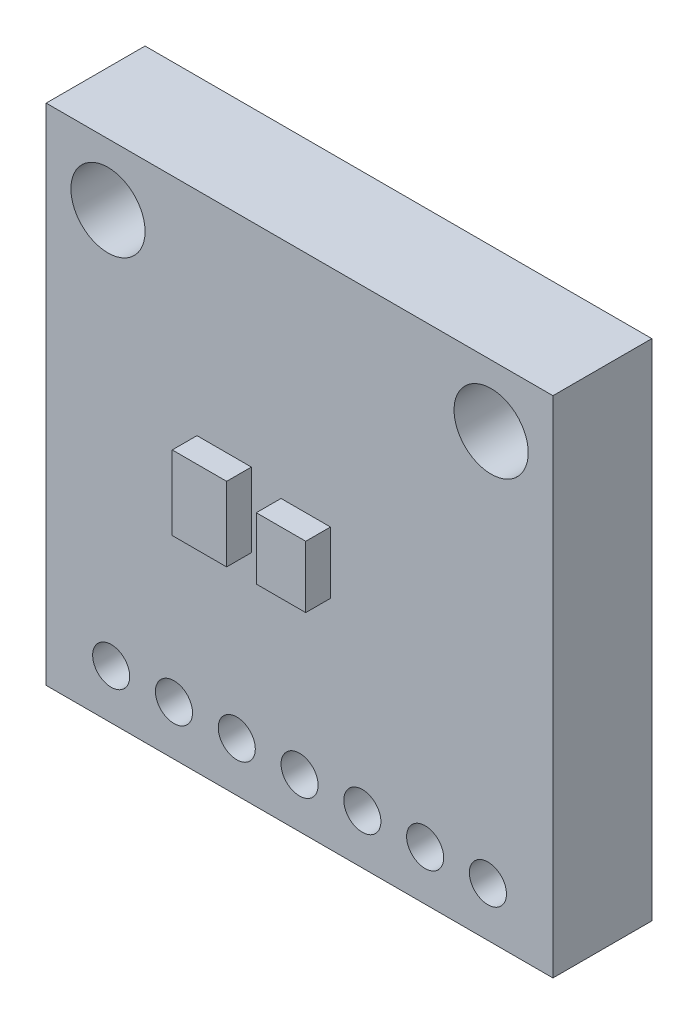
ISO-10303-21;
HEADER;
FILE_DESCRIPTION(('STEP AP214'),'2;1');
FILE_NAME('part.step','',(''),(''),'','','');
FILE_SCHEMA(('AUTOMOTIVE_DESIGN { 1 0 10303 214 1 1 1 1 }'));
ENDSEC;
DATA;
#1=APPLICATION_CONTEXT('core data for automotive mechanical design processes');
#2=APPLICATION_PROTOCOL_DEFINITION('international standard','automotive_design',2000,#1);
#3=PRODUCT_CONTEXT('',#1,'mechanical');
#4=PRODUCT('Part','Part','',(#3));
#5=PRODUCT_RELATED_PRODUCT_CATEGORY('part','',(#4));
#6=PRODUCT_DEFINITION_FORMATION('','',#4);
#7=PRODUCT_DEFINITION_CONTEXT('part definition',#1,'design');
#8=PRODUCT_DEFINITION('design','',#6,#7);
#9=PRODUCT_DEFINITION_SHAPE('','',#8);
#10=(LENGTH_UNIT() NAMED_UNIT(*) SI_UNIT(.MILLI.,.METRE.));
#11=(NAMED_UNIT(*) PLANE_ANGLE_UNIT() SI_UNIT($,.RADIAN.));
#12=(NAMED_UNIT(*) SI_UNIT($,.STERADIAN.) SOLID_ANGLE_UNIT());
#13=UNCERTAINTY_MEASURE_WITH_UNIT(LENGTH_MEASURE(1.E-05),#10,'distance_accuracy_value','');
#14=(GEOMETRIC_REPRESENTATION_CONTEXT(3) GLOBAL_UNCERTAINTY_ASSIGNED_CONTEXT((#13)) GLOBAL_UNIT_ASSIGNED_CONTEXT((#10,
#11,#12)) REPRESENTATION_CONTEXT('',''));
#15=CARTESIAN_POINT('',(0.,0.,0.));
#16=DIRECTION('',(0.,0.,1.));
#17=DIRECTION('',(1.,0.,0.));
#18=AXIS2_PLACEMENT_3D('',#15,#16,#17);
#19=CARTESIAN_POINT('',(9.5,11.3,1.));
#20=DIRECTION('',(1.,0.,0.));
#21=DIRECTION('',(0.,0.,-1.));
#22=AXIS2_PLACEMENT_3D('',#19,#20,#21);
#23=PLANE('',#22);
#24=DIRECTION('',(0.,-1.,0.));
#25=VECTOR('',#24,1.);
#26=CARTESIAN_POINT('',(9.5,11.3,0.));
#27=LINE('',#26,#25);
#28=CARTESIAN_POINT('',(9.5,11.3,0.));
#29=VERTEX_POINT('',#28);
#30=CARTESIAN_POINT('',(9.5,8.8,0.));
#31=VERTEX_POINT('',#30);
#32=EDGE_CURVE('E107',#29,#31,#27,.T.);
#33=ORIENTED_EDGE('',*,*,#32,.T.);
#34=DIRECTION('',(0.,0.,-1.));
#35=VECTOR('',#34,1.);
#36=CARTESIAN_POINT('',(9.5,8.8,1.));
#37=LINE('',#36,#35);
#38=CARTESIAN_POINT('',(9.5,8.8,1.));
#39=VERTEX_POINT('',#38);
#40=EDGE_CURVE('E12',#39,#31,#37,.T.);
#41=ORIENTED_EDGE('',*,*,#40,.F.);
#42=DIRECTION('',(0.,-1.,0.));
#43=VECTOR('',#42,1.);
#44=CARTESIAN_POINT('',(9.5,11.3,1.));
#45=LINE('',#44,#43);
#46=CARTESIAN_POINT('',(9.5,11.3,1.));
#47=VERTEX_POINT('',#46);
#48=EDGE_CURVE('E95',#47,#39,#45,.T.);
#49=ORIENTED_EDGE('',*,*,#48,.F.);
#50=DIRECTION('',(0.,0.,-1.));
#51=VECTOR('',#50,1.);
#52=CARTESIAN_POINT('',(9.5,11.3,1.));
#53=LINE('',#52,#51);
#54=EDGE_CURVE('E103',#47,#29,#53,.T.);
#55=ORIENTED_EDGE('',*,*,#54,.T.);
#56=EDGE_LOOP('',(#33,#41,#49,#55));
#57=FACE_BOUND('',#56,.T.);
#58=ADVANCED_FACE('F44',(#57),#23,.F.);
#59=CARTESIAN_POINT('',(9.5,8.8,1.));
#60=DIRECTION('',(0.,1.,0.));
#61=DIRECTION('',(0.,0.,1.));
#62=AXIS2_PLACEMENT_3D('',#59,#60,#61);
#63=PLANE('',#62);
#64=DIRECTION('',(1.,0.,0.));
#65=VECTOR('',#64,1.);
#66=CARTESIAN_POINT('',(9.5,8.8,0.));
#67=LINE('',#66,#65);
#68=CARTESIAN_POINT('',(11.5,8.8,0.));
#69=VERTEX_POINT('',#68);
#70=EDGE_CURVE('E99',#31,#69,#67,.T.);
#71=ORIENTED_EDGE('',*,*,#70,.T.);
#72=DIRECTION('',(0.,0.,-1.));
#73=VECTOR('',#72,1.);
#74=CARTESIAN_POINT('',(11.5,8.8,1.));
#75=LINE('',#74,#73);
#76=CARTESIAN_POINT('',(11.5,8.8,1.));
#77=VERTEX_POINT('',#76);
#78=EDGE_CURVE('E52',#77,#69,#75,.T.);
#79=ORIENTED_EDGE('',*,*,#78,.F.);
#80=DIRECTION('',(1.,0.,0.));
#81=VECTOR('',#80,1.);
#82=CARTESIAN_POINT('',(9.5,8.8,1.));
#83=LINE('',#82,#81);
#84=EDGE_CURVE('E90',#39,#77,#83,.T.);
#85=ORIENTED_EDGE('',*,*,#84,.F.);
#86=ORIENTED_EDGE('',*,*,#40,.T.);
#87=EDGE_LOOP('',(#71,#79,#85,#86));
#88=FACE_BOUND('',#87,.T.);
#89=ADVANCED_FACE('F98',(#88),#63,.F.);
#90=CARTESIAN_POINT('',(11.5,11.3,1.));
#91=DIRECTION('',(-1.,0.,0.));
#92=DIRECTION('',(0.,0.,1.));
#93=AXIS2_PLACEMENT_3D('',#90,#91,#92);
#94=PLANE('',#93);
#95=DIRECTION('',(0.,1.,0.));
#96=VECTOR('',#95,1.);
#97=CARTESIAN_POINT('',(11.5,11.3,0.));
#98=LINE('',#97,#96);
#99=CARTESIAN_POINT('',(11.5,11.3,0.));
#100=VERTEX_POINT('',#99);
#101=EDGE_CURVE('E77',#69,#100,#98,.T.);
#102=ORIENTED_EDGE('',*,*,#101,.T.);
#103=DIRECTION('',(0.,0.,-1.));
#104=VECTOR('',#103,1.);
#105=CARTESIAN_POINT('',(11.5,11.3,1.));
#106=LINE('',#105,#104);
#107=CARTESIAN_POINT('',(11.5,11.3,1.));
#108=VERTEX_POINT('',#107);
#109=EDGE_CURVE('E100',#108,#100,#106,.T.);
#110=ORIENTED_EDGE('',*,*,#109,.F.);
#111=DIRECTION('',(0.,1.,0.));
#112=VECTOR('',#111,1.);
#113=CARTESIAN_POINT('',(11.5,11.3,1.));
#114=LINE('',#113,#112);
#115=EDGE_CURVE('E93',#77,#108,#114,.T.);
#116=ORIENTED_EDGE('',*,*,#115,.F.);
#117=ORIENTED_EDGE('',*,*,#78,.T.);
#118=EDGE_LOOP('',(#102,#110,#116,#117));
#119=FACE_BOUND('',#118,.T.);
#120=ADVANCED_FACE('F101',(#119),#94,.F.);
#121=CARTESIAN_POINT('',(9.5,11.3,1.));
#122=DIRECTION('',(0.,-1.,0.));
#123=DIRECTION('',(0.,0.,-1.));
#124=AXIS2_PLACEMENT_3D('',#121,#122,#123);
#125=PLANE('',#124);
#126=DIRECTION('',(-1.,0.,0.));
#127=VECTOR('',#126,1.);
#128=CARTESIAN_POINT('',(9.5,11.3,0.));
#129=LINE('',#128,#127);
#130=EDGE_CURVE('E83',#100,#29,#129,.T.);
#131=ORIENTED_EDGE('',*,*,#130,.T.);
#132=ORIENTED_EDGE('',*,*,#54,.F.);
#133=DIRECTION('',(-1.,0.,0.));
#134=VECTOR('',#133,1.);
#135=CARTESIAN_POINT('',(9.5,11.3,1.));
#136=LINE('',#135,#134);
#137=EDGE_CURVE('E60',#108,#47,#136,.T.);
#138=ORIENTED_EDGE('',*,*,#137,.F.);
#139=ORIENTED_EDGE('',*,*,#109,.T.);
#140=EDGE_LOOP('',(#131,#132,#138,#139));
#141=FACE_BOUND('',#140,.T.);
#142=ADVANCED_FACE('F114',(#141),#125,.F.);
#143=CARTESIAN_POINT('',(0.,0.,1.));
#144=DIRECTION('',(0.,0.,1.));
#145=DIRECTION('',(1.,0.,0.));
#146=AXIS2_PLACEMENT_3D('',#143,#144,#145);
#147=PLANE('',#146);
#148=ORIENTED_EDGE('',*,*,#48,.T.);
#149=ORIENTED_EDGE('',*,*,#84,.T.);
#150=ORIENTED_EDGE('',*,*,#115,.T.);
#151=ORIENTED_EDGE('',*,*,#137,.T.);
#152=EDGE_LOOP('',(#148,#149,#150,#151));
#153=FACE_BOUND('',#152,.T.);
#154=ADVANCED_FACE('F91',(#153),#147,.T.);
#155=CARTESIAN_POINT('',(0.,0.,0.));
#156=DIRECTION('',(0.,0.,1.));
#157=DIRECTION('',(1.,0.,0.));
#158=AXIS2_PLACEMENT_3D('',#155,#156,#157);
#159=PLANE('',#158);
#160=ORIENTED_EDGE('',*,*,#32,.F.);
#161=ORIENTED_EDGE('',*,*,#130,.F.);
#162=ORIENTED_EDGE('',*,*,#101,.F.);
#163=ORIENTED_EDGE('',*,*,#70,.F.);
#164=EDGE_LOOP('',(#160,#161,#162,#163));
#165=FACE_BOUND('',#164,.T.);
#166=ADVANCED_FACE('F117',(#165),#159,.F.);
#167=CLOSED_SHELL('',(#58,#89,#120,#142,#154,#166));
#168=MANIFOLD_SOLID_BREP('B2',#167);
#169=CARTESIAN_POINT('',(6.1,11.8,1.));
#170=DIRECTION('',(1.,0.,0.));
#171=DIRECTION('',(0.,0.,-1.));
#172=AXIS2_PLACEMENT_3D('',#169,#170,#171);
#173=PLANE('',#172);
#174=DIRECTION('',(0.,-1.,0.));
#175=VECTOR('',#174,1.);
#176=CARTESIAN_POINT('',(6.1,11.8,0.));
#177=LINE('',#176,#175);
#178=CARTESIAN_POINT('',(6.1,11.8,0.));
#179=VERTEX_POINT('',#178);
#180=CARTESIAN_POINT('',(6.1,8.8,0.));
#181=VERTEX_POINT('',#180);
#182=EDGE_CURVE('E240',#179,#181,#177,.T.);
#183=ORIENTED_EDGE('',*,*,#182,.T.);
#184=DIRECTION('',(0.,0.,-1.));
#185=VECTOR('',#184,1.);
#186=CARTESIAN_POINT('',(6.1,8.8,1.));
#187=LINE('',#186,#185);
#188=CARTESIAN_POINT('',(6.1,8.8,1.));
#189=VERTEX_POINT('',#188);
#190=EDGE_CURVE('E42',#189,#181,#187,.T.);
#191=ORIENTED_EDGE('',*,*,#190,.F.);
#192=DIRECTION('',(0.,-1.,0.));
#193=VECTOR('',#192,1.);
#194=CARTESIAN_POINT('',(6.1,11.8,1.));
#195=LINE('',#194,#193);
#196=CARTESIAN_POINT('',(6.1,11.8,1.));
#197=VERTEX_POINT('',#196);
#198=EDGE_CURVE('E228',#197,#189,#195,.T.);
#199=ORIENTED_EDGE('',*,*,#198,.F.);
#200=DIRECTION('',(0.,0.,-1.));
#201=VECTOR('',#200,1.);
#202=CARTESIAN_POINT('',(6.1,11.8,1.));
#203=LINE('',#202,#201);
#204=EDGE_CURVE('E236',#197,#179,#203,.T.);
#205=ORIENTED_EDGE('',*,*,#204,.T.);
#206=EDGE_LOOP('',(#183,#191,#199,#205));
#207=FACE_BOUND('',#206,.T.);
#208=ADVANCED_FACE('F177',(#207),#173,.F.);
#209=CARTESIAN_POINT('',(6.1,8.8,1.));
#210=DIRECTION('',(0.,1.,0.));
#211=DIRECTION('',(0.,0.,1.));
#212=AXIS2_PLACEMENT_3D('',#209,#210,#211);
#213=PLANE('',#212);
#214=DIRECTION('',(1.,0.,0.));
#215=VECTOR('',#214,1.);
#216=CARTESIAN_POINT('',(6.1,8.8,0.));
#217=LINE('',#216,#215);
#218=CARTESIAN_POINT('',(8.3,8.8,0.));
#219=VERTEX_POINT('',#218);
#220=EDGE_CURVE('E232',#181,#219,#217,.T.);
#221=ORIENTED_EDGE('',*,*,#220,.T.);
#222=DIRECTION('',(0.,0.,-1.));
#223=VECTOR('',#222,1.);
#224=CARTESIAN_POINT('',(8.3,8.8,1.));
#225=LINE('',#224,#223);
#226=CARTESIAN_POINT('',(8.3,8.8,1.));
#227=VERTEX_POINT('',#226);
#228=EDGE_CURVE('E185',#227,#219,#225,.T.);
#229=ORIENTED_EDGE('',*,*,#228,.F.);
#230=DIRECTION('',(1.,0.,0.));
#231=VECTOR('',#230,1.);
#232=CARTESIAN_POINT('',(6.1,8.8,1.));
#233=LINE('',#232,#231);
#234=EDGE_CURVE('E223',#189,#227,#233,.T.);
#235=ORIENTED_EDGE('',*,*,#234,.F.);
#236=ORIENTED_EDGE('',*,*,#190,.T.);
#237=EDGE_LOOP('',(#221,#229,#235,#236));
#238=FACE_BOUND('',#237,.T.);
#239=ADVANCED_FACE('F231',(#238),#213,.F.);
#240=CARTESIAN_POINT('',(8.3,11.8,1.));
#241=DIRECTION('',(-1.,0.,0.));
#242=DIRECTION('',(0.,0.,1.));
#243=AXIS2_PLACEMENT_3D('',#240,#241,#242);
#244=PLANE('',#243);
#245=DIRECTION('',(0.,1.,0.));
#246=VECTOR('',#245,1.);
#247=CARTESIAN_POINT('',(8.3,11.8,0.));
#248=LINE('',#247,#246);
#249=CARTESIAN_POINT('',(8.3,11.8,0.));
#250=VERTEX_POINT('',#249);
#251=EDGE_CURVE('E210',#219,#250,#248,.T.);
#252=ORIENTED_EDGE('',*,*,#251,.T.);
#253=DIRECTION('',(0.,0.,-1.));
#254=VECTOR('',#253,1.);
#255=CARTESIAN_POINT('',(8.3,11.8,1.));
#256=LINE('',#255,#254);
#257=CARTESIAN_POINT('',(8.3,11.8,1.));
#258=VERTEX_POINT('',#257);
#259=EDGE_CURVE('E233',#258,#250,#256,.T.);
#260=ORIENTED_EDGE('',*,*,#259,.F.);
#261=DIRECTION('',(0.,1.,0.));
#262=VECTOR('',#261,1.);
#263=CARTESIAN_POINT('',(8.3,11.8,1.));
#264=LINE('',#263,#262);
#265=EDGE_CURVE('E226',#227,#258,#264,.T.);
#266=ORIENTED_EDGE('',*,*,#265,.F.);
#267=ORIENTED_EDGE('',*,*,#228,.T.);
#268=EDGE_LOOP('',(#252,#260,#266,#267));
#269=FACE_BOUND('',#268,.T.);
#270=ADVANCED_FACE('F234',(#269),#244,.F.);
#271=CARTESIAN_POINT('',(6.1,11.8,1.));
#272=DIRECTION('',(0.,-1.,0.));
#273=DIRECTION('',(1.,0.,0.));
#274=AXIS2_PLACEMENT_3D('',#271,#272,#273);
#275=PLANE('',#274);
#276=DIRECTION('',(-1.,0.,0.));
#277=VECTOR('',#276,1.);
#278=CARTESIAN_POINT('',(6.1,11.8,0.));
#279=LINE('',#278,#277);
#280=EDGE_CURVE('E216',#250,#179,#279,.T.);
#281=ORIENTED_EDGE('',*,*,#280,.T.);
#282=ORIENTED_EDGE('',*,*,#204,.F.);
#283=DIRECTION('',(-1.,0.,0.));
#284=VECTOR('',#283,1.);
#285=CARTESIAN_POINT('',(6.1,11.8,1.));
#286=LINE('',#285,#284);
#287=EDGE_CURVE('E193',#258,#197,#286,.T.);
#288=ORIENTED_EDGE('',*,*,#287,.F.);
#289=ORIENTED_EDGE('',*,*,#259,.T.);
#290=EDGE_LOOP('',(#281,#282,#288,#289));
#291=FACE_BOUND('',#290,.T.);
#292=ADVANCED_FACE('F247',(#291),#275,.F.);
#293=CARTESIAN_POINT('',(0.,0.,1.));
#294=DIRECTION('',(0.,0.,1.));
#295=DIRECTION('',(1.,0.,0.));
#296=AXIS2_PLACEMENT_3D('',#293,#294,#295);
#297=PLANE('',#296);
#298=ORIENTED_EDGE('',*,*,#198,.T.);
#299=ORIENTED_EDGE('',*,*,#234,.T.);
#300=ORIENTED_EDGE('',*,*,#265,.T.);
#301=ORIENTED_EDGE('',*,*,#287,.T.);
#302=EDGE_LOOP('',(#298,#299,#300,#301));
#303=FACE_BOUND('',#302,.T.);
#304=ADVANCED_FACE('F224',(#303),#297,.T.);
#305=CARTESIAN_POINT('',(0.,0.,0.));
#306=DIRECTION('',(0.,0.,1.));
#307=DIRECTION('',(1.,0.,0.));
#308=AXIS2_PLACEMENT_3D('',#305,#306,#307);
#309=PLANE('',#308);
#310=ORIENTED_EDGE('',*,*,#182,.F.);
#311=ORIENTED_EDGE('',*,*,#280,.F.);
#312=ORIENTED_EDGE('',*,*,#251,.F.);
#313=ORIENTED_EDGE('',*,*,#220,.F.);
#314=EDGE_LOOP('',(#310,#311,#312,#313));
#315=FACE_BOUND('',#314,.T.);
#316=ADVANCED_FACE('F250',(#315),#309,.F.);
#317=CLOSED_SHELL('',(#208,#239,#270,#292,#304,#316));
#318=MANIFOLD_SOLID_BREP('B6',#317);
#319=CARTESIAN_POINT('',(0.,0.,-4.));
#320=DIRECTION('',(-1.,0.,0.));
#321=DIRECTION('',(0.,0.,1.));
#322=AXIS2_PLACEMENT_3D('',#319,#320,#321);
#323=PLANE('',#322);
#324=DIRECTION('',(0.,-1.,0.));
#325=VECTOR('',#324,1.);
#326=CARTESIAN_POINT('',(0.,0.,0.));
#327=LINE('',#326,#325);
#328=CARTESIAN_POINT('',(0.,20.4,0.));
#329=VERTEX_POINT('',#328);
#330=CARTESIAN_POINT('',(0.,0.,0.));
#331=VERTEX_POINT('',#330);
#332=EDGE_CURVE('E366',#329,#331,#327,.T.);
#333=ORIENTED_EDGE('',*,*,#332,.F.);
#334=DIRECTION('',(0.,0.,1.));
#335=VECTOR('',#334,1.);
#336=CARTESIAN_POINT('',(0.,20.4,-4.));
#337=LINE('',#336,#335);
#338=CARTESIAN_POINT('',(0.,20.4,-4.));
#339=VERTEX_POINT('',#338);
#340=EDGE_CURVE('E175',#339,#329,#337,.T.);
#341=ORIENTED_EDGE('',*,*,#340,.F.);
#342=DIRECTION('',(0.,-1.,0.));
#343=VECTOR('',#342,1.);
#344=CARTESIAN_POINT('',(0.,0.,-4.));
#345=LINE('',#344,#343);
#346=CARTESIAN_POINT('',(0.,0.,-4.));
#347=VERTEX_POINT('',#346);
#348=EDGE_CURVE('E359',#339,#347,#345,.T.);
#349=ORIENTED_EDGE('',*,*,#348,.T.);
#350=DIRECTION('',(0.,0.,1.));
#351=VECTOR('',#350,1.);
#352=CARTESIAN_POINT('',(0.,0.,-4.));
#353=LINE('',#352,#351);
#354=EDGE_CURVE('E304',#347,#331,#353,.T.);
#355=ORIENTED_EDGE('',*,*,#354,.T.);
#356=EDGE_LOOP('',(#333,#341,#349,#355));
#357=FACE_BOUND('',#356,.T.);
#358=ADVANCED_FACE('F301',(#357),#323,.T.);
#359=CARTESIAN_POINT('',(0.,20.4,-4.));
#360=DIRECTION('',(0.,1.,0.));
#361=DIRECTION('',(0.,0.,1.));
#362=AXIS2_PLACEMENT_3D('',#359,#360,#361);
#363=PLANE('',#362);
#364=DIRECTION('',(-1.,0.,0.));
#365=VECTOR('',#364,1.);
#366=CARTESIAN_POINT('',(0.,20.4,0.));
#367=LINE('',#366,#365);
#368=CARTESIAN_POINT('',(20.5,20.4,0.));
#369=VERTEX_POINT('',#368);
#370=EDGE_CURVE('E361',#369,#329,#367,.T.);
#371=ORIENTED_EDGE('',*,*,#370,.F.);
#372=DIRECTION('',(0.,0.,1.));
#373=VECTOR('',#372,1.);
#374=CARTESIAN_POINT('',(20.5,20.4,-4.));
#375=LINE('',#374,#373);
#376=CARTESIAN_POINT('',(20.5,20.4,-4.));
#377=VERTEX_POINT('',#376);
#378=EDGE_CURVE('E310',#377,#369,#375,.T.);
#379=ORIENTED_EDGE('',*,*,#378,.F.);
#380=DIRECTION('',(-1.,0.,0.));
#381=VECTOR('',#380,1.);
#382=CARTESIAN_POINT('',(0.,20.4,-4.));
#383=LINE('',#382,#381);
#384=EDGE_CURVE('E356',#377,#339,#383,.T.);
#385=ORIENTED_EDGE('',*,*,#384,.T.);
#386=ORIENTED_EDGE('',*,*,#340,.T.);
#387=EDGE_LOOP('',(#371,#379,#385,#386));
#388=FACE_BOUND('',#387,.T.);
#389=ADVANCED_FACE('F377',(#388),#363,.T.);
#390=CARTESIAN_POINT('',(20.5,0.,-4.));
#391=DIRECTION('',(1.,0.,0.));
#392=DIRECTION('',(0.,0.,-1.));
#393=AXIS2_PLACEMENT_3D('',#390,#391,#392);
#394=PLANE('',#393);
#395=DIRECTION('',(0.,1.,0.));
#396=VECTOR('',#395,1.);
#397=CARTESIAN_POINT('',(20.5,0.,0.));
#398=LINE('',#397,#396);
#399=CARTESIAN_POINT('',(20.5,0.,0.));
#400=VERTEX_POINT('',#399);
#401=EDGE_CURVE('E351',#400,#369,#398,.T.);
#402=ORIENTED_EDGE('',*,*,#401,.F.);
#403=DIRECTION('',(0.,0.,1.));
#404=VECTOR('',#403,1.);
#405=CARTESIAN_POINT('',(20.5,0.,-4.));
#406=LINE('',#405,#404);
#407=CARTESIAN_POINT('',(20.5,0.,-4.));
#408=VERTEX_POINT('',#407);
#409=EDGE_CURVE('E346',#408,#400,#406,.T.);
#410=ORIENTED_EDGE('',*,*,#409,.F.);
#411=DIRECTION('',(0.,1.,0.));
#412=VECTOR('',#411,1.);
#413=CARTESIAN_POINT('',(20.5,0.,-4.));
#414=LINE('',#413,#412);
#415=EDGE_CURVE('E349',#408,#377,#414,.T.);
#416=ORIENTED_EDGE('',*,*,#415,.T.);
#417=ORIENTED_EDGE('',*,*,#378,.T.);
#418=EDGE_LOOP('',(#402,#410,#416,#417));
#419=FACE_BOUND('',#418,.T.);
#420=ADVANCED_FACE('F348',(#419),#394,.T.);
#421=CARTESIAN_POINT('',(0.,0.,-4.));
#422=DIRECTION('',(0.,-1.,0.));
#423=DIRECTION('',(0.,0.,-1.));
#424=AXIS2_PLACEMENT_3D('',#421,#422,#423);
#425=PLANE('',#424);
#426=DIRECTION('',(1.,0.,0.));
#427=VECTOR('',#426,1.);
#428=CARTESIAN_POINT('',(0.,0.,0.));
#429=LINE('',#428,#427);
#430=EDGE_CURVE('E369',#331,#400,#429,.T.);
#431=ORIENTED_EDGE('',*,*,#430,.F.);
#432=ORIENTED_EDGE('',*,*,#354,.F.);
#433=DIRECTION('',(1.,0.,0.));
#434=VECTOR('',#433,1.);
#435=CARTESIAN_POINT('',(0.,0.,-4.));
#436=LINE('',#435,#434);
#437=EDGE_CURVE('E355',#347,#408,#436,.T.);
#438=ORIENTED_EDGE('',*,*,#437,.T.);
#439=ORIENTED_EDGE('',*,*,#409,.T.);
#440=EDGE_LOOP('',(#431,#432,#438,#439));
#441=FACE_BOUND('',#440,.T.);
#442=ADVANCED_FACE('F358',(#441),#425,.T.);
#443=CARTESIAN_POINT('',(0.,0.,-4.));
#444=DIRECTION('',(0.,0.,-1.));
#445=DIRECTION('',(-1.,0.,0.));
#446=AXIS2_PLACEMENT_3D('',#443,#444,#445);
#447=PLANE('',#446);
#448=CARTESIAN_POINT('',(17.87,2.,-4.));
#449=DIRECTION('',(0.,0.,1.));
#450=DIRECTION('',(1.,0.,0.));
#451=AXIS2_PLACEMENT_3D('',#448,#449,#450);
#452=CIRCLE('',#451,0.750000000000002);
#453=CARTESIAN_POINT('',(18.62,2.,-4.));
#454=VERTEX_POINT('',#453);
#455=EDGE_CURVE('E438',#454,#454,#452,.T.);
#456=ORIENTED_EDGE('',*,*,#455,.T.);
#457=EDGE_LOOP('',(#456));
#458=FACE_BOUND('',#457,.T.);
#459=CARTESIAN_POINT('',(15.33,2.,-4.));
#460=DIRECTION('',(0.,0.,1.));
#461=DIRECTION('',(1.,0.,0.));
#462=AXIS2_PLACEMENT_3D('',#459,#460,#461);
#463=CIRCLE('',#462,0.750000000000004);
#464=CARTESIAN_POINT('',(16.08,2.,-4.));
#465=VERTEX_POINT('',#464);
#466=EDGE_CURVE('E446',#465,#465,#463,.T.);
#467=ORIENTED_EDGE('',*,*,#466,.T.);
#468=EDGE_LOOP('',(#467));
#469=FACE_BOUND('',#468,.T.);
#470=CARTESIAN_POINT('',(12.79,2.,-4.));
#471=DIRECTION('',(0.,0.,1.));
#472=DIRECTION('',(1.,0.,0.));
#473=AXIS2_PLACEMENT_3D('',#470,#471,#472);
#474=CIRCLE('',#473,0.75);
#475=CARTESIAN_POINT('',(13.54,2.,-4.));
#476=VERTEX_POINT('',#475);
#477=EDGE_CURVE('E452',#476,#476,#474,.T.);
#478=ORIENTED_EDGE('',*,*,#477,.T.);
#479=EDGE_LOOP('',(#478));
#480=FACE_BOUND('',#479,.T.);
#481=CARTESIAN_POINT('',(10.25,2.,-4.));
#482=DIRECTION('',(0.,0.,1.));
#483=DIRECTION('',(1.,0.,0.));
#484=AXIS2_PLACEMENT_3D('',#481,#482,#483);
#485=CIRCLE('',#484,0.75);
#486=CARTESIAN_POINT('',(11.,2.,-4.));
#487=VERTEX_POINT('',#486);
#488=EDGE_CURVE('E458',#487,#487,#485,.T.);
#489=ORIENTED_EDGE('',*,*,#488,.T.);
#490=EDGE_LOOP('',(#489));
#491=FACE_BOUND('',#490,.T.);
#492=CARTESIAN_POINT('',(7.71,2.,-4.));
#493=DIRECTION('',(0.,0.,1.));
#494=DIRECTION('',(1.,0.,0.));
#495=AXIS2_PLACEMENT_3D('',#492,#493,#494);
#496=CIRCLE('',#495,0.749999999999999);
#497=CARTESIAN_POINT('',(8.46,2.,-4.));
#498=VERTEX_POINT('',#497);
#499=EDGE_CURVE('E464',#498,#498,#496,.T.);
#500=ORIENTED_EDGE('',*,*,#499,.T.);
#501=EDGE_LOOP('',(#500));
#502=FACE_BOUND('',#501,.T.);
#503=CARTESIAN_POINT('',(5.17,2.,-4.));
#504=DIRECTION('',(0.,0.,1.));
#505=DIRECTION('',(1.,0.,0.));
#506=AXIS2_PLACEMENT_3D('',#503,#504,#505);
#507=CIRCLE('',#506,0.75);
#508=CARTESIAN_POINT('',(5.92000000000001,2.,-4.));
#509=VERTEX_POINT('',#508);
#510=EDGE_CURVE('E470',#509,#509,#507,.T.);
#511=ORIENTED_EDGE('',*,*,#510,.T.);
#512=EDGE_LOOP('',(#511));
#513=FACE_BOUND('',#512,.T.);
#514=CARTESIAN_POINT('',(2.63,2.,-4.));
#515=DIRECTION('',(0.,0.,1.));
#516=DIRECTION('',(1.,0.,0.));
#517=AXIS2_PLACEMENT_3D('',#514,#515,#516);
#518=CIRCLE('',#517,0.75);
#519=CARTESIAN_POINT('',(3.38,2.,-4.));
#520=VERTEX_POINT('',#519);
#521=EDGE_CURVE('E476',#520,#520,#518,.T.);
#522=ORIENTED_EDGE('',*,*,#521,.T.);
#523=EDGE_LOOP('',(#522));
#524=FACE_BOUND('',#523,.T.);
#525=CARTESIAN_POINT('',(18.,17.9,-4.));
#526=DIRECTION('',(0.,0.,1.));
#527=DIRECTION('',(1.,0.,0.));
#528=AXIS2_PLACEMENT_3D('',#525,#526,#527);
#529=CIRCLE('',#528,1.5);
#530=CARTESIAN_POINT('',(19.5,17.9,-4.));
#531=VERTEX_POINT('',#530);
#532=EDGE_CURVE('E482',#531,#531,#529,.T.);
#533=ORIENTED_EDGE('',*,*,#532,.T.);
#534=EDGE_LOOP('',(#533));
#535=FACE_BOUND('',#534,.T.);
#536=CARTESIAN_POINT('',(2.5,17.9,-4.));
#537=DIRECTION('',(0.,0.,1.));
#538=DIRECTION('',(1.,0.,0.));
#539=AXIS2_PLACEMENT_3D('',#536,#537,#538);
#540=CIRCLE('',#539,1.5);
#541=CARTESIAN_POINT('',(4.,17.9,-4.));
#542=VERTEX_POINT('',#541);
#543=EDGE_CURVE('E370',#542,#542,#540,.T.);
#544=ORIENTED_EDGE('',*,*,#543,.T.);
#545=EDGE_LOOP('',(#544));
#546=FACE_BOUND('',#545,.T.);
#547=ORIENTED_EDGE('',*,*,#348,.F.);
#548=ORIENTED_EDGE('',*,*,#384,.F.);
#549=ORIENTED_EDGE('',*,*,#415,.F.);
#550=ORIENTED_EDGE('',*,*,#437,.F.);
#551=EDGE_LOOP('',(#547,#548,#549,#550));
#552=FACE_BOUND('',#551,.T.);
#553=ADVANCED_FACE('F354',(#458,#469,#480,#491,#502,#513,#524,#535,#546,#552),#447,.T.);
#554=CARTESIAN_POINT('',(0.,0.,0.));
#555=DIRECTION('',(0.,0.,-1.));
#556=DIRECTION('',(-1.,0.,0.));
#557=AXIS2_PLACEMENT_3D('',#554,#555,#556);
#558=PLANE('',#557);
#559=CARTESIAN_POINT('',(17.87,2.,0.));
#560=DIRECTION('',(0.,0.,1.));
#561=DIRECTION('',(1.,0.,0.));
#562=AXIS2_PLACEMENT_3D('',#559,#560,#561);
#563=CIRCLE('',#562,0.750000000000002);
#564=CARTESIAN_POINT('',(18.62,2.,0.));
#565=VERTEX_POINT('',#564);
#566=EDGE_CURVE('E441',#565,#565,#563,.T.);
#567=ORIENTED_EDGE('',*,*,#566,.F.);
#568=EDGE_LOOP('',(#567));
#569=FACE_BOUND('',#568,.T.);
#570=CARTESIAN_POINT('',(15.33,2.,0.));
#571=DIRECTION('',(0.,0.,1.));
#572=DIRECTION('',(1.,0.,0.));
#573=AXIS2_PLACEMENT_3D('',#570,#571,#572);
#574=CIRCLE('',#573,0.750000000000004);
#575=CARTESIAN_POINT('',(16.08,2.,0.));
#576=VERTEX_POINT('',#575);
#577=EDGE_CURVE('E443',#576,#576,#574,.T.);
#578=ORIENTED_EDGE('',*,*,#577,.F.);
#579=EDGE_LOOP('',(#578));
#580=FACE_BOUND('',#579,.T.);
#581=CARTESIAN_POINT('',(12.79,2.,0.));
#582=DIRECTION('',(0.,0.,1.));
#583=DIRECTION('',(1.,0.,0.));
#584=AXIS2_PLACEMENT_3D('',#581,#582,#583);
#585=CIRCLE('',#584,0.75);
#586=CARTESIAN_POINT('',(13.54,2.,0.));
#587=VERTEX_POINT('',#586);
#588=EDGE_CURVE('E449',#587,#587,#585,.T.);
#589=ORIENTED_EDGE('',*,*,#588,.F.);
#590=EDGE_LOOP('',(#589));
#591=FACE_BOUND('',#590,.T.);
#592=CARTESIAN_POINT('',(10.25,2.,0.));
#593=DIRECTION('',(0.,0.,1.));
#594=DIRECTION('',(1.,0.,0.));
#595=AXIS2_PLACEMENT_3D('',#592,#593,#594);
#596=CIRCLE('',#595,0.75);
#597=CARTESIAN_POINT('',(11.,2.,0.));
#598=VERTEX_POINT('',#597);
#599=EDGE_CURVE('E455',#598,#598,#596,.T.);
#600=ORIENTED_EDGE('',*,*,#599,.F.);
#601=EDGE_LOOP('',(#600));
#602=FACE_BOUND('',#601,.T.);
#603=CARTESIAN_POINT('',(7.71,2.,0.));
#604=DIRECTION('',(0.,0.,1.));
#605=DIRECTION('',(1.,0.,0.));
#606=AXIS2_PLACEMENT_3D('',#603,#604,#605);
#607=CIRCLE('',#606,0.749999999999999);
#608=CARTESIAN_POINT('',(8.46,2.,0.));
#609=VERTEX_POINT('',#608);
#610=EDGE_CURVE('E461',#609,#609,#607,.T.);
#611=ORIENTED_EDGE('',*,*,#610,.F.);
#612=EDGE_LOOP('',(#611));
#613=FACE_BOUND('',#612,.T.);
#614=CARTESIAN_POINT('',(5.17,2.,0.));
#615=DIRECTION('',(0.,0.,1.));
#616=DIRECTION('',(1.,0.,0.));
#617=AXIS2_PLACEMENT_3D('',#614,#615,#616);
#618=CIRCLE('',#617,0.75);
#619=CARTESIAN_POINT('',(5.92000000000001,2.,0.));
#620=VERTEX_POINT('',#619);
#621=EDGE_CURVE('E467',#620,#620,#618,.T.);
#622=ORIENTED_EDGE('',*,*,#621,.F.);
#623=EDGE_LOOP('',(#622));
#624=FACE_BOUND('',#623,.T.);
#625=CARTESIAN_POINT('',(2.63,2.,0.));
#626=DIRECTION('',(0.,0.,1.));
#627=DIRECTION('',(1.,0.,0.));
#628=AXIS2_PLACEMENT_3D('',#625,#626,#627);
#629=CIRCLE('',#628,0.75);
#630=CARTESIAN_POINT('',(3.38,2.,0.));
#631=VERTEX_POINT('',#630);
#632=EDGE_CURVE('E473',#631,#631,#629,.T.);
#633=ORIENTED_EDGE('',*,*,#632,.F.);
#634=EDGE_LOOP('',(#633));
#635=FACE_BOUND('',#634,.T.);
#636=CARTESIAN_POINT('',(18.,17.9,0.));
#637=DIRECTION('',(0.,0.,1.));
#638=DIRECTION('',(1.,0.,0.));
#639=AXIS2_PLACEMENT_3D('',#636,#637,#638);
#640=CIRCLE('',#639,1.5);
#641=CARTESIAN_POINT('',(19.5,17.9,0.));
#642=VERTEX_POINT('',#641);
#643=EDGE_CURVE('E479',#642,#642,#640,.T.);
#644=ORIENTED_EDGE('',*,*,#643,.F.);
#645=EDGE_LOOP('',(#644));
#646=FACE_BOUND('',#645,.T.);
#647=CARTESIAN_POINT('',(2.5,17.9,0.));
#648=DIRECTION('',(0.,0.,1.));
#649=DIRECTION('',(1.,0.,0.));
#650=AXIS2_PLACEMENT_3D('',#647,#648,#649);
#651=CIRCLE('',#650,1.5);
#652=CARTESIAN_POINT('',(4.,17.9,0.));
#653=VERTEX_POINT('',#652);
#654=EDGE_CURVE('E485',#653,#653,#651,.T.);
#655=ORIENTED_EDGE('',*,*,#654,.F.);
#656=EDGE_LOOP('',(#655));
#657=FACE_BOUND('',#656,.T.);
#658=ORIENTED_EDGE('',*,*,#332,.T.);
#659=ORIENTED_EDGE('',*,*,#430,.T.);
#660=ORIENTED_EDGE('',*,*,#401,.T.);
#661=ORIENTED_EDGE('',*,*,#370,.T.);
#662=EDGE_LOOP('',(#658,#659,#660,#661));
#663=FACE_BOUND('',#662,.T.);
#664=ADVANCED_FACE('F376',(#569,#580,#591,#602,#613,#624,#635,#646,#657,#663),#558,.F.);
#665=CARTESIAN_POINT('',(2.5,17.9,-4.));
#666=DIRECTION('',(0.,0.,1.));
#667=DIRECTION('',(1.,0.,0.));
#668=AXIS2_PLACEMENT_3D('',#665,#666,#667);
#669=CYLINDRICAL_SURFACE('',#668,1.5);
#670=ORIENTED_EDGE('',*,*,#543,.F.);
#671=EDGE_LOOP('',(#670));
#672=FACE_BOUND('',#671,.T.);
#673=ORIENTED_EDGE('',*,*,#654,.T.);
#674=EDGE_LOOP('',(#673));
#675=FACE_BOUND('',#674,.T.);
#676=ADVANCED_FACE('F395',(#672,#675),#669,.F.);
#677=CARTESIAN_POINT('',(18.,17.9,-4.));
#678=DIRECTION('',(0.,0.,1.));
#679=DIRECTION('',(1.,0.,0.));
#680=AXIS2_PLACEMENT_3D('',#677,#678,#679);
#681=CYLINDRICAL_SURFACE('',#680,1.5);
#682=ORIENTED_EDGE('',*,*,#532,.F.);
#683=EDGE_LOOP('',(#682));
#684=FACE_BOUND('',#683,.T.);
#685=ORIENTED_EDGE('',*,*,#643,.T.);
#686=EDGE_LOOP('',(#685));
#687=FACE_BOUND('',#686,.T.);
#688=ADVANCED_FACE('F402',(#684,#687),#681,.F.);
#689=CARTESIAN_POINT('',(2.63,2.,-4.));
#690=DIRECTION('',(0.,0.,1.));
#691=DIRECTION('',(1.,0.,0.));
#692=AXIS2_PLACEMENT_3D('',#689,#690,#691);
#693=CYLINDRICAL_SURFACE('',#692,0.75);
#694=ORIENTED_EDGE('',*,*,#521,.F.);
#695=EDGE_LOOP('',(#694));
#696=FACE_BOUND('',#695,.T.);
#697=ORIENTED_EDGE('',*,*,#632,.T.);
#698=EDGE_LOOP('',(#697));
#699=FACE_BOUND('',#698,.T.);
#700=ADVANCED_FACE('F406',(#696,#699),#693,.F.);
#701=CARTESIAN_POINT('',(5.17,2.,-4.));
#702=DIRECTION('',(0.,0.,1.));
#703=DIRECTION('',(1.,0.,0.));
#704=AXIS2_PLACEMENT_3D('',#701,#702,#703);
#705=CYLINDRICAL_SURFACE('',#704,0.75);
#706=ORIENTED_EDGE('',*,*,#510,.F.);
#707=EDGE_LOOP('',(#706));
#708=FACE_BOUND('',#707,.T.);
#709=ORIENTED_EDGE('',*,*,#621,.T.);
#710=EDGE_LOOP('',(#709));
#711=FACE_BOUND('',#710,.T.);
#712=ADVANCED_FACE('F410',(#708,#711),#705,.F.);
#713=CARTESIAN_POINT('',(7.71,2.,-4.));
#714=DIRECTION('',(0.,0.,1.));
#715=DIRECTION('',(1.,0.,0.));
#716=AXIS2_PLACEMENT_3D('',#713,#714,#715);
#717=CYLINDRICAL_SURFACE('',#716,0.749999999999999);
#718=ORIENTED_EDGE('',*,*,#499,.F.);
#719=EDGE_LOOP('',(#718));
#720=FACE_BOUND('',#719,.T.);
#721=ORIENTED_EDGE('',*,*,#610,.T.);
#722=EDGE_LOOP('',(#721));
#723=FACE_BOUND('',#722,.T.);
#724=ADVANCED_FACE('F414',(#720,#723),#717,.F.);
#725=CARTESIAN_POINT('',(10.25,2.,-4.));
#726=DIRECTION('',(0.,0.,1.));
#727=DIRECTION('',(1.,0.,0.));
#728=AXIS2_PLACEMENT_3D('',#725,#726,#727);
#729=CYLINDRICAL_SURFACE('',#728,0.75);
#730=ORIENTED_EDGE('',*,*,#488,.F.);
#731=EDGE_LOOP('',(#730));
#732=FACE_BOUND('',#731,.T.);
#733=ORIENTED_EDGE('',*,*,#599,.T.);
#734=EDGE_LOOP('',(#733));
#735=FACE_BOUND('',#734,.T.);
#736=ADVANCED_FACE('F418',(#732,#735),#729,.F.);
#737=CARTESIAN_POINT('',(12.79,2.,-4.));
#738=DIRECTION('',(0.,0.,1.));
#739=DIRECTION('',(1.,0.,0.));
#740=AXIS2_PLACEMENT_3D('',#737,#738,#739);
#741=CYLINDRICAL_SURFACE('',#740,0.75);
#742=ORIENTED_EDGE('',*,*,#477,.F.);
#743=EDGE_LOOP('',(#742));
#744=FACE_BOUND('',#743,.T.);
#745=ORIENTED_EDGE('',*,*,#588,.T.);
#746=EDGE_LOOP('',(#745));
#747=FACE_BOUND('',#746,.T.);
#748=ADVANCED_FACE('F422',(#744,#747),#741,.F.);
#749=CARTESIAN_POINT('',(15.33,2.,-4.));
#750=DIRECTION('',(0.,0.,1.));
#751=DIRECTION('',(1.,0.,0.));
#752=AXIS2_PLACEMENT_3D('',#749,#750,#751);
#753=CYLINDRICAL_SURFACE('',#752,0.750000000000004);
#754=ORIENTED_EDGE('',*,*,#466,.F.);
#755=EDGE_LOOP('',(#754));
#756=FACE_BOUND('',#755,.T.);
#757=ORIENTED_EDGE('',*,*,#577,.T.);
#758=EDGE_LOOP('',(#757));
#759=FACE_BOUND('',#758,.T.);
#760=ADVANCED_FACE('F426',(#756,#759),#753,.F.);
#761=CARTESIAN_POINT('',(17.87,2.,-4.));
#762=DIRECTION('',(0.,0.,1.));
#763=DIRECTION('',(1.,0.,0.));
#764=AXIS2_PLACEMENT_3D('',#761,#762,#763);
#765=CYLINDRICAL_SURFACE('',#764,0.750000000000002);
#766=ORIENTED_EDGE('',*,*,#455,.F.);
#767=EDGE_LOOP('',(#766));
#768=FACE_BOUND('',#767,.T.);
#769=ORIENTED_EDGE('',*,*,#566,.T.);
#770=EDGE_LOOP('',(#769));
#771=FACE_BOUND('',#770,.T.);
#772=ADVANCED_FACE('F430',(#768,#771),#765,.F.);
#773=CLOSED_SHELL('',(#358,#389,#420,#442,#553,#664,#676,#688,#700,#712,#724,#736,#748,#760,#772));
#774=MANIFOLD_SOLID_BREP('B36',#773);
#775=ADVANCED_BREP_SHAPE_REPRESENTATION('',(#18,#168,#318,#774),#14);
#776=SHAPE_DEFINITION_REPRESENTATION(#9,#775);
ENDSEC;
END-ISO-10303-21;
